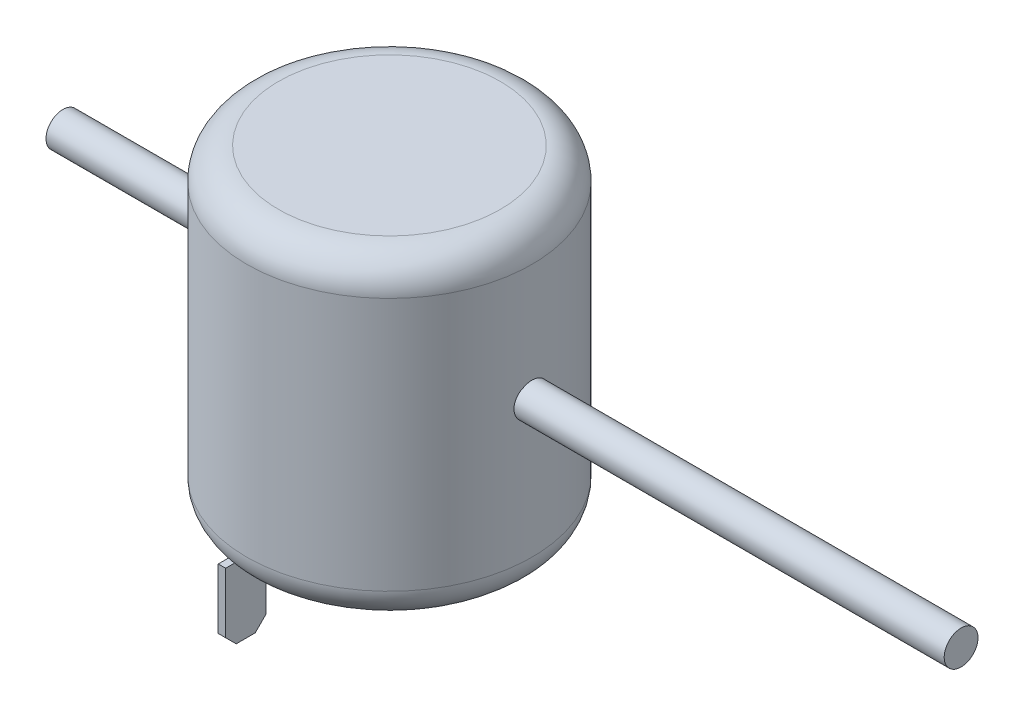
ISO-10303-21;
HEADER;
FILE_DESCRIPTION(('STEP AP214'),'2;1');
FILE_NAME('part.step','',(''),(''),'','','');
FILE_SCHEMA(('AUTOMOTIVE_DESIGN { 1 0 10303 214 1 1 1 1 }'));
ENDSEC;
DATA;
#1=APPLICATION_CONTEXT('core data for automotive mechanical design processes');
#2=APPLICATION_PROTOCOL_DEFINITION('international standard','automotive_design',2000,#1);
#3=PRODUCT_CONTEXT('',#1,'mechanical');
#4=PRODUCT('Part','Part','',(#3));
#5=PRODUCT_RELATED_PRODUCT_CATEGORY('part','',(#4));
#6=PRODUCT_DEFINITION_FORMATION('','',#4);
#7=PRODUCT_DEFINITION_CONTEXT('part definition',#1,'design');
#8=PRODUCT_DEFINITION('design','',#6,#7);
#9=PRODUCT_DEFINITION_SHAPE('','',#8);
#10=(LENGTH_UNIT() NAMED_UNIT(*) SI_UNIT(.MILLI.,.METRE.));
#11=(NAMED_UNIT(*) PLANE_ANGLE_UNIT() SI_UNIT($,.RADIAN.));
#12=(NAMED_UNIT(*) SI_UNIT($,.STERADIAN.) SOLID_ANGLE_UNIT());
#13=UNCERTAINTY_MEASURE_WITH_UNIT(LENGTH_MEASURE(1.E-05),#10,'distance_accuracy_value','');
#14=(GEOMETRIC_REPRESENTATION_CONTEXT(3) GLOBAL_UNCERTAINTY_ASSIGNED_CONTEXT((#13)) GLOBAL_UNIT_ASSIGNED_CONTEXT((#10,
#11,#12)) REPRESENTATION_CONTEXT('',''));
#15=CARTESIAN_POINT('',(0.,0.,0.));
#16=DIRECTION('',(0.,0.,1.));
#17=DIRECTION('',(1.,0.,0.));
#18=AXIS2_PLACEMENT_3D('',#15,#16,#17);
#19=CARTESIAN_POINT('',(0.,-15.9,0.));
#20=DIRECTION('',(0.,-1.,0.));
#21=DIRECTION('',(0.,0.,-1.));
#22=AXIS2_PLACEMENT_3D('',#19,#20,#21);
#23=PLANE('',#22);
#24=CARTESIAN_POINT('',(0.,-15.9,0.));
#25=DIRECTION('',(0.,-1.,0.));
#26=DIRECTION('',(0.,0.,-1.));
#27=AXIS2_PLACEMENT_3D('',#24,#25,#26);
#28=CIRCLE('',#27,10.5);
#29=CARTESIAN_POINT('',(0.,-15.9,-10.5));
#30=VERTEX_POINT('',#29);
#31=EDGE_CURVE('E11',#30,#30,#28,.T.);
#32=ORIENTED_EDGE('',*,*,#31,.T.);
#33=EDGE_LOOP('',(#32));
#34=FACE_BOUND('',#33,.T.);
#35=ADVANCED_FACE('F43',(#34),#23,.T.);
#36=CARTESIAN_POINT('',(0.,-12.9,0.));
#37=DIRECTION('',(0.,-1.,0.));
#38=DIRECTION('',(0.,0.,-1.));
#39=AXIS2_PLACEMENT_3D('',#36,#37,#38);
#40=TOROIDAL_SURFACE('',#39,10.5,3.);
#41=CARTESIAN_POINT('',(0.,-12.9,0.));
#42=DIRECTION('',(0.,-1.,0.));
#43=DIRECTION('',(0.,0.,-1.));
#44=AXIS2_PLACEMENT_3D('',#41,#42,#43);
#45=CIRCLE('',#44,13.5);
#46=CARTESIAN_POINT('',(0.,-12.9,-13.5));
#47=VERTEX_POINT('',#46);
#48=EDGE_CURVE('E50',#47,#47,#45,.T.);
#49=ORIENTED_EDGE('',*,*,#48,.T.);
#50=EDGE_LOOP('',(#49));
#51=FACE_BOUND('',#50,.T.);
#52=ORIENTED_EDGE('',*,*,#31,.F.);
#53=EDGE_LOOP('',(#52));
#54=FACE_BOUND('',#53,.T.);
#55=ADVANCED_FACE('F98',(#51,#54),#40,.T.);
#56=CARTESIAN_POINT('',(0.,0.,0.));
#57=DIRECTION('',(0.,-1.,0.));
#58=DIRECTION('',(0.,0.,-1.));
#59=AXIS2_PLACEMENT_3D('',#56,#57,#58);
#60=CYLINDRICAL_SURFACE('',#59,13.5);
#61=CARTESIAN_POINT('',(0.,11.1,0.));
#62=DIRECTION('',(0.,-1.,0.));
#63=DIRECTION('',(0.,0.,-1.));
#64=AXIS2_PLACEMENT_3D('',#61,#62,#63);
#65=CIRCLE('',#64,13.5);
#66=CARTESIAN_POINT('',(0.,11.1,-13.5));
#67=VERTEX_POINT('',#66);
#68=EDGE_CURVE('E54',#67,#67,#65,.T.);
#69=ORIENTED_EDGE('',*,*,#68,.T.);
#70=EDGE_LOOP('',(#69));
#71=FACE_BOUND('',#70,.T.);
#72=ORIENTED_EDGE('',*,*,#48,.F.);
#73=EDGE_LOOP('',(#72));
#74=FACE_BOUND('',#73,.T.);
#75=ADVANCED_FACE('F95',(#71,#74),#60,.T.);
#76=CARTESIAN_POINT('',(0.,11.1,0.));
#77=DIRECTION('',(0.,-1.,0.));
#78=DIRECTION('',(0.,0.,-1.));
#79=AXIS2_PLACEMENT_3D('',#76,#77,#78);
#80=TOROIDAL_SURFACE('',#79,10.5,3.);
#81=CARTESIAN_POINT('',(0.,14.1,0.));
#82=DIRECTION('',(0.,-1.,0.));
#83=DIRECTION('',(0.,0.,-1.));
#84=AXIS2_PLACEMENT_3D('',#81,#82,#83);
#85=CIRCLE('',#84,10.5);
#86=CARTESIAN_POINT('',(0.,14.1,-10.5));
#87=VERTEX_POINT('',#86);
#88=EDGE_CURVE('E58',#87,#87,#85,.T.);
#89=ORIENTED_EDGE('',*,*,#88,.T.);
#90=EDGE_LOOP('',(#89));
#91=FACE_BOUND('',#90,.T.);
#92=ORIENTED_EDGE('',*,*,#68,.F.);
#93=EDGE_LOOP('',(#92));
#94=FACE_BOUND('',#93,.T.);
#95=ADVANCED_FACE('F91',(#91,#94),#80,.T.);
#96=CARTESIAN_POINT('',(10.5,14.1,0.));
#97=DIRECTION('',(0.,1.,0.));
#98=DIRECTION('',(0.,0.,1.));
#99=AXIS2_PLACEMENT_3D('',#96,#97,#98);
#100=PLANE('',#99);
#101=ORIENTED_EDGE('',*,*,#88,.F.);
#102=EDGE_LOOP('',(#101));
#103=FACE_BOUND('',#102,.T.);
#104=ADVANCED_FACE('F89',(#103),#100,.T.);
#105=CLOSED_SHELL('',(#35,#55,#75,#95,#104));
#106=CARTESIAN_POINT('',(0.,13.6,0.));
#107=DIRECTION('',(0.,-1.,0.));
#108=DIRECTION('',(0.,0.,-1.));
#109=AXIS2_PLACEMENT_3D('',#106,#107,#108);
#110=PLANE('',#109);
#111=CARTESIAN_POINT('',(0.,13.6,0.));
#112=DIRECTION('',(0.,-1.,0.));
#113=DIRECTION('',(0.,0.,-1.));
#114=AXIS2_PLACEMENT_3D('',#111,#112,#113);
#115=CIRCLE('',#114,10.);
#116=CARTESIAN_POINT('',(0.,13.6,-10.));
#117=VERTEX_POINT('',#116);
#118=EDGE_CURVE('E63',#117,#117,#115,.T.);
#119=ORIENTED_EDGE('',*,*,#118,.T.);
#120=EDGE_LOOP('',(#119));
#121=FACE_BOUND('',#120,.T.);
#122=ADVANCED_FACE('F80',(#121),#110,.T.);
#123=CARTESIAN_POINT('',(0.,0.,0.));
#124=DIRECTION('',(0.,-1.,0.));
#125=DIRECTION('',(0.,0.,-1.));
#126=AXIS2_PLACEMENT_3D('',#123,#124,#125);
#127=CYLINDRICAL_SURFACE('',#126,10.);
#128=CARTESIAN_POINT('',(0.,-15.4,0.));
#129=DIRECTION('',(0.,-1.,0.));
#130=DIRECTION('',(0.,0.,-1.));
#131=AXIS2_PLACEMENT_3D('',#128,#129,#130);
#132=CIRCLE('',#131,10.);
#133=CARTESIAN_POINT('',(0.,-15.4,-10.));
#134=VERTEX_POINT('',#133);
#135=EDGE_CURVE('E66',#134,#134,#132,.T.);
#136=ORIENTED_EDGE('',*,*,#135,.T.);
#137=EDGE_LOOP('',(#136));
#138=FACE_BOUND('',#137,.T.);
#139=ORIENTED_EDGE('',*,*,#118,.F.);
#140=EDGE_LOOP('',(#139));
#141=FACE_BOUND('',#140,.T.);
#142=ADVANCED_FACE('F70',(#138,#141),#127,.F.);
#143=CARTESIAN_POINT('',(0.,-15.4,0.));
#144=DIRECTION('',(0.,1.,0.));
#145=DIRECTION('',(0.,0.,1.));
#146=AXIS2_PLACEMENT_3D('',#143,#144,#145);
#147=PLANE('',#146);
#148=ORIENTED_EDGE('',*,*,#135,.F.);
#149=EDGE_LOOP('',(#148));
#150=FACE_BOUND('',#149,.T.);
#151=ADVANCED_FACE('F73',(#150),#147,.T.);
#152=CLOSED_SHELL('',(#122,#142,#151));
#153=ORIENTED_CLOSED_SHELL('',*,#152,.T.);
#154=BREP_WITH_VOIDS('B2',#105,(#153));
#155=CARTESIAN_POINT('',(-14.3,-33.1,1.9));
#156=DIRECTION('',(1.,0.,0.));
#157=DIRECTION('',(0.,0.,-1.));
#158=AXIS2_PLACEMENT_3D('',#155,#156,#157);
#159=PLANE('',#158);
#160=DIRECTION('',(0.,0.,-1.));
#161=VECTOR('',#160,1.);
#162=CARTESIAN_POINT('',(-14.3,-33.1,1.9));
#163=LINE('',#162,#161);
#164=CARTESIAN_POINT('',(-14.3,-33.1,0.899999999999998));
#165=VERTEX_POINT('',#164);
#166=CARTESIAN_POINT('',(-14.3,-33.1,-0.899999999999997));
#167=VERTEX_POINT('',#166);
#168=EDGE_CURVE('E246',#165,#167,#163,.T.);
#169=ORIENTED_EDGE('',*,*,#168,.F.);
#170=DIRECTION('',(0.,0.707106781186549,0.707106781186546));
#171=VECTOR('',#170,1.);
#172=CARTESIAN_POINT('',(-14.3,-33.1,0.899999999999997));
#173=LINE('',#172,#171);
#174=CARTESIAN_POINT('',(-14.3,-32.1,1.9));
#175=VERTEX_POINT('',#174);
#176=EDGE_CURVE('E258',#165,#175,#173,.T.);
#177=ORIENTED_EDGE('',*,*,#176,.T.);
#178=DIRECTION('',(0.,1.,0.));
#179=VECTOR('',#178,1.);
#180=CARTESIAN_POINT('',(-14.3,-33.1,1.9));
#181=LINE('',#180,#179);
#182=CARTESIAN_POINT('',(-14.3,-26.4,1.9));
#183=VERTEX_POINT('',#182);
#184=EDGE_CURVE('E236',#175,#183,#181,.T.);
#185=ORIENTED_EDGE('',*,*,#184,.T.);
#186=DIRECTION('',(0.,0.,-1.));
#187=VECTOR('',#186,1.);
#188=CARTESIAN_POINT('',(-14.3,-26.4,1.9));
#189=LINE('',#188,#187);
#190=CARTESIAN_POINT('',(-14.3,-26.4,-1.9));
#191=VERTEX_POINT('',#190);
#192=EDGE_CURVE('E231',#183,#191,#189,.T.);
#193=ORIENTED_EDGE('',*,*,#192,.T.);
#194=DIRECTION('',(0.,1.,0.));
#195=VECTOR('',#194,1.);
#196=CARTESIAN_POINT('',(-14.3,-33.1,-1.9));
#197=LINE('',#196,#195);
#198=CARTESIAN_POINT('',(-14.3,-32.1,-1.9));
#199=VERTEX_POINT('',#198);
#200=EDGE_CURVE('E215',#199,#191,#197,.T.);
#201=ORIENTED_EDGE('',*,*,#200,.F.);
#202=DIRECTION('',(0.,-0.707106781186549,0.707106781186546));
#203=VECTOR('',#202,1.);
#204=CARTESIAN_POINT('',(-14.3,-33.1,-0.899999999999997));
#205=LINE('',#204,#203);
#206=EDGE_CURVE('E256',#199,#167,#205,.T.);
#207=ORIENTED_EDGE('',*,*,#206,.T.);
#208=EDGE_LOOP('',(#169,#177,#185,#193,#201,#207));
#209=FACE_BOUND('',#208,.T.);
#210=ADVANCED_FACE('F162',(#209),#159,.F.);
#211=CARTESIAN_POINT('',(-14.3,-33.1,-1.9));
#212=DIRECTION('',(0.,0.,1.));
#213=DIRECTION('',(1.,0.,0.));
#214=AXIS2_PLACEMENT_3D('',#211,#212,#213);
#215=PLANE('',#214);
#216=DIRECTION('',(0.,1.,0.));
#217=VECTOR('',#216,1.);
#218=CARTESIAN_POINT('',(-13.6,-33.1,-1.9));
#219=LINE('',#218,#217);
#220=CARTESIAN_POINT('',(-13.6,-32.1,-1.9));
#221=VERTEX_POINT('',#220);
#222=CARTESIAN_POINT('',(-13.6,-26.4,-1.9));
#223=VERTEX_POINT('',#222);
#224=EDGE_CURVE('E225',#221,#223,#219,.T.);
#225=ORIENTED_EDGE('',*,*,#224,.F.);
#226=DIRECTION('',(-1.,0.,0.));
#227=VECTOR('',#226,1.);
#228=CARTESIAN_POINT('',(-14.3,-32.1,-1.9));
#229=LINE('',#228,#227);
#230=EDGE_CURVE('E40',#221,#199,#229,.T.);
#231=ORIENTED_EDGE('',*,*,#230,.T.);
#232=ORIENTED_EDGE('',*,*,#200,.T.);
#233=DIRECTION('',(1.,0.,0.));
#234=VECTOR('',#233,1.);
#235=CARTESIAN_POINT('',(-14.3,-26.4,-1.9));
#236=LINE('',#235,#234);
#237=EDGE_CURVE('E218',#191,#223,#236,.T.);
#238=ORIENTED_EDGE('',*,*,#237,.T.);
#239=EDGE_LOOP('',(#225,#231,#232,#238));
#240=FACE_BOUND('',#239,.T.);
#241=ADVANCED_FACE('F217',(#240),#215,.F.);
#242=CARTESIAN_POINT('',(-13.6,-33.1,1.9));
#243=DIRECTION('',(-1.,0.,0.));
#244=DIRECTION('',(0.,0.,1.));
#245=AXIS2_PLACEMENT_3D('',#242,#243,#244);
#246=PLANE('',#245);
#247=DIRECTION('',(0.,1.,0.));
#248=VECTOR('',#247,1.);
#249=CARTESIAN_POINT('',(-13.6,-33.1,1.9));
#250=LINE('',#249,#248);
#251=CARTESIAN_POINT('',(-13.6,-32.1,1.9));
#252=VERTEX_POINT('',#251);
#253=CARTESIAN_POINT('',(-13.6,-26.4,1.9));
#254=VERTEX_POINT('',#253);
#255=EDGE_CURVE('E248',#252,#254,#250,.T.);
#256=ORIENTED_EDGE('',*,*,#255,.F.);
#257=DIRECTION('',(0.,-0.707106781186549,-0.707106781186546));
#258=VECTOR('',#257,1.);
#259=CARTESIAN_POINT('',(-13.6,-33.1,0.899999999999997));
#260=LINE('',#259,#258);
#261=CARTESIAN_POINT('',(-13.6,-33.1,0.899999999999997));
#262=VERTEX_POINT('',#261);
#263=EDGE_CURVE('E170',#252,#262,#260,.T.);
#264=ORIENTED_EDGE('',*,*,#263,.T.);
#265=DIRECTION('',(0.,0.,1.));
#266=VECTOR('',#265,1.);
#267=CARTESIAN_POINT('',(-13.6,-33.1,1.9));
#268=LINE('',#267,#266);
#269=CARTESIAN_POINT('',(-13.6,-33.1,-0.899999999999997));
#270=VERTEX_POINT('',#269);
#271=EDGE_CURVE('E240',#270,#262,#268,.T.);
#272=ORIENTED_EDGE('',*,*,#271,.F.);
#273=DIRECTION('',(0.,0.707106781186549,-0.707106781186546));
#274=VECTOR('',#273,1.);
#275=CARTESIAN_POINT('',(-13.6,-33.1,-0.899999999999997));
#276=LINE('',#275,#274);
#277=EDGE_CURVE('E177',#270,#221,#276,.T.);
#278=ORIENTED_EDGE('',*,*,#277,.T.);
#279=ORIENTED_EDGE('',*,*,#224,.T.);
#280=DIRECTION('',(0.,0.,1.));
#281=VECTOR('',#280,1.);
#282=CARTESIAN_POINT('',(-13.6,-26.4,1.9));
#283=LINE('',#282,#281);
#284=EDGE_CURVE('E233',#223,#254,#283,.T.);
#285=ORIENTED_EDGE('',*,*,#284,.T.);
#286=EDGE_LOOP('',(#256,#264,#272,#278,#279,#285));
#287=FACE_BOUND('',#286,.T.);
#288=ADVANCED_FACE('F263',(#287),#246,.F.);
#289=CARTESIAN_POINT('',(-14.3,-33.1,1.9));
#290=DIRECTION('',(0.,0.,-1.));
#291=DIRECTION('',(-1.,0.,0.));
#292=AXIS2_PLACEMENT_3D('',#289,#290,#291);
#293=PLANE('',#292);
#294=ORIENTED_EDGE('',*,*,#184,.F.);
#295=DIRECTION('',(1.,0.,0.));
#296=VECTOR('',#295,1.);
#297=CARTESIAN_POINT('',(-13.6,-32.1,1.9));
#298=LINE('',#297,#296);
#299=EDGE_CURVE('E185',#175,#252,#298,.T.);
#300=ORIENTED_EDGE('',*,*,#299,.T.);
#301=ORIENTED_EDGE('',*,*,#255,.T.);
#302=DIRECTION('',(-1.,0.,0.));
#303=VECTOR('',#302,1.);
#304=CARTESIAN_POINT('',(-14.3,-26.4,1.9));
#305=LINE('',#304,#303);
#306=EDGE_CURVE('E244',#254,#183,#305,.T.);
#307=ORIENTED_EDGE('',*,*,#306,.T.);
#308=EDGE_LOOP('',(#294,#300,#301,#307));
#309=FACE_BOUND('',#308,.T.);
#310=ADVANCED_FACE('F271',(#309),#293,.F.);
#311=CARTESIAN_POINT('',(-14.3,-33.1,-1.9));
#312=DIRECTION('',(0.,-1.,0.));
#313=DIRECTION('',(0.,0.,-1.));
#314=AXIS2_PLACEMENT_3D('',#311,#312,#313);
#315=PLANE('',#314);
#316=ORIENTED_EDGE('',*,*,#271,.T.);
#317=DIRECTION('',(-1.,0.,0.));
#318=VECTOR('',#317,1.);
#319=CARTESIAN_POINT('',(-14.3,-33.1,0.899999999999997));
#320=LINE('',#319,#318);
#321=EDGE_CURVE('E253',#262,#165,#320,.T.);
#322=ORIENTED_EDGE('',*,*,#321,.T.);
#323=ORIENTED_EDGE('',*,*,#168,.T.);
#324=DIRECTION('',(1.,0.,0.));
#325=VECTOR('',#324,1.);
#326=CARTESIAN_POINT('',(-13.6,-33.1,-0.899999999999998));
#327=LINE('',#326,#325);
#328=EDGE_CURVE('E224',#167,#270,#327,.T.);
#329=ORIENTED_EDGE('',*,*,#328,.T.);
#330=EDGE_LOOP('',(#316,#322,#323,#329));
#331=FACE_BOUND('',#330,.T.);
#332=ADVANCED_FACE('F267',(#331),#315,.T.);
#333=CARTESIAN_POINT('',(-14.3,-26.4,-1.9));
#334=DIRECTION('',(0.,-1.,0.));
#335=DIRECTION('',(0.,0.,-1.));
#336=AXIS2_PLACEMENT_3D('',#333,#334,#335);
#337=PLANE('',#336);
#338=ORIENTED_EDGE('',*,*,#192,.F.);
#339=ORIENTED_EDGE('',*,*,#306,.F.);
#340=ORIENTED_EDGE('',*,*,#284,.F.);
#341=ORIENTED_EDGE('',*,*,#237,.F.);
#342=EDGE_LOOP('',(#338,#339,#340,#341));
#343=FACE_BOUND('',#342,.T.);
#344=ADVANCED_FACE('F229',(#343),#337,.F.);
#345=CARTESIAN_POINT('',(-14.3,-33.1,0.899999999999997));
#346=DIRECTION('',(0.,-0.707106781186546,0.707106781186549));
#347=DIRECTION('',(0.,-0.707106781186549,-0.707106781186546));
#348=AXIS2_PLACEMENT_3D('',#345,#346,#347);
#349=PLANE('',#348);
#350=ORIENTED_EDGE('',*,*,#263,.F.);
#351=ORIENTED_EDGE('',*,*,#299,.F.);
#352=ORIENTED_EDGE('',*,*,#176,.F.);
#353=ORIENTED_EDGE('',*,*,#321,.F.);
#354=EDGE_LOOP('',(#350,#351,#352,#353));
#355=FACE_BOUND('',#354,.T.);
#356=ADVANCED_FACE('F270',(#355),#349,.T.);
#357=CARTESIAN_POINT('',(-14.3,-33.1,-0.899999999999997));
#358=DIRECTION('',(0.,-0.707106781186546,-0.707106781186549));
#359=DIRECTION('',(0.,0.707106781186549,-0.707106781186546));
#360=AXIS2_PLACEMENT_3D('',#357,#358,#359);
#361=PLANE('',#360);
#362=ORIENTED_EDGE('',*,*,#206,.F.);
#363=ORIENTED_EDGE('',*,*,#230,.F.);
#364=ORIENTED_EDGE('',*,*,#277,.F.);
#365=ORIENTED_EDGE('',*,*,#328,.F.);
#366=EDGE_LOOP('',(#362,#363,#364,#365));
#367=FACE_BOUND('',#366,.T.);
#368=ADVANCED_FACE('F164',(#367),#361,.T.);
#369=CLOSED_SHELL('',(#210,#241,#288,#310,#332,#344,#356,#368));
#370=MANIFOLD_SOLID_BREP('B6',#369);
#371=CARTESIAN_POINT('',(-30.9,1.07886773370253E-13,0.));
#372=DIRECTION('',(1.,0.,0.));
#373=DIRECTION('',(0.,1.,0.));
#374=AXIS2_PLACEMENT_3D('',#371,#372,#373);
#375=PLANE('',#374);
#376=CARTESIAN_POINT('',(-30.9,1.07886773370253E-13,0.));
#377=DIRECTION('',(-1.,0.,0.));
#378=DIRECTION('',(0.,-1.,0.));
#379=AXIS2_PLACEMENT_3D('',#376,#377,#378);
#380=CIRCLE('',#379,1.6);
#381=CARTESIAN_POINT('',(-30.9,-1.59999999999989,0.));
#382=VERTEX_POINT('',#381);
#383=EDGE_CURVE('E161',#382,#382,#380,.T.);
#384=ORIENTED_EDGE('',*,*,#383,.T.);
#385=EDGE_LOOP('',(#384));
#386=FACE_BOUND('',#385,.T.);
#387=ADVANCED_FACE('F338',(#386),#375,.F.);
#388=CARTESIAN_POINT('',(-30.9,1.07886773370253E-13,0.));
#389=DIRECTION('',(-1.,0.,0.));
#390=DIRECTION('',(0.,-1.,0.));
#391=AXIS2_PLACEMENT_3D('',#388,#389,#390);
#392=CYLINDRICAL_SURFACE('',#391,1.5999999999999);
#393=ORIENTED_EDGE('',*,*,#383,.F.);
#394=EDGE_LOOP('',(#393));
#395=FACE_BOUND('',#394,.T.);
#396=CARTESIAN_POINT('',(54.1,0.,0.));
#397=DIRECTION('',(-1.,0.,0.));
#398=DIRECTION('',(0.,-1.,0.));
#399=AXIS2_PLACEMENT_3D('',#396,#397,#398);
#400=CIRCLE('',#399,1.5999999999998);
#401=CARTESIAN_POINT('',(54.1,-1.59999999999979,0.));
#402=VERTEX_POINT('',#401);
#403=EDGE_CURVE('E344',#402,#402,#400,.T.);
#404=ORIENTED_EDGE('',*,*,#403,.T.);
#405=EDGE_LOOP('',(#404));
#406=FACE_BOUND('',#405,.T.);
#407=ADVANCED_FACE('F350',(#395,#406),#392,.T.);
#408=CARTESIAN_POINT('',(54.1,1.59999999999981,0.));
#409=DIRECTION('',(-1.,0.,0.));
#410=DIRECTION('',(0.,-1.,0.));
#411=AXIS2_PLACEMENT_3D('',#408,#409,#410);
#412=PLANE('',#411);
#413=ORIENTED_EDGE('',*,*,#403,.F.);
#414=EDGE_LOOP('',(#413));
#415=FACE_BOUND('',#414,.T.);
#416=ADVANCED_FACE('F352',(#415),#412,.F.);
#417=CLOSED_SHELL('',(#387,#407,#416));
#418=MANIFOLD_SOLID_BREP('B34',#417);
#419=ADVANCED_BREP_SHAPE_REPRESENTATION('',(#18,#154,#370,#418),#14);
#420=SHAPE_DEFINITION_REPRESENTATION(#9,#419);
ENDSEC;
END-ISO-10303-21;
